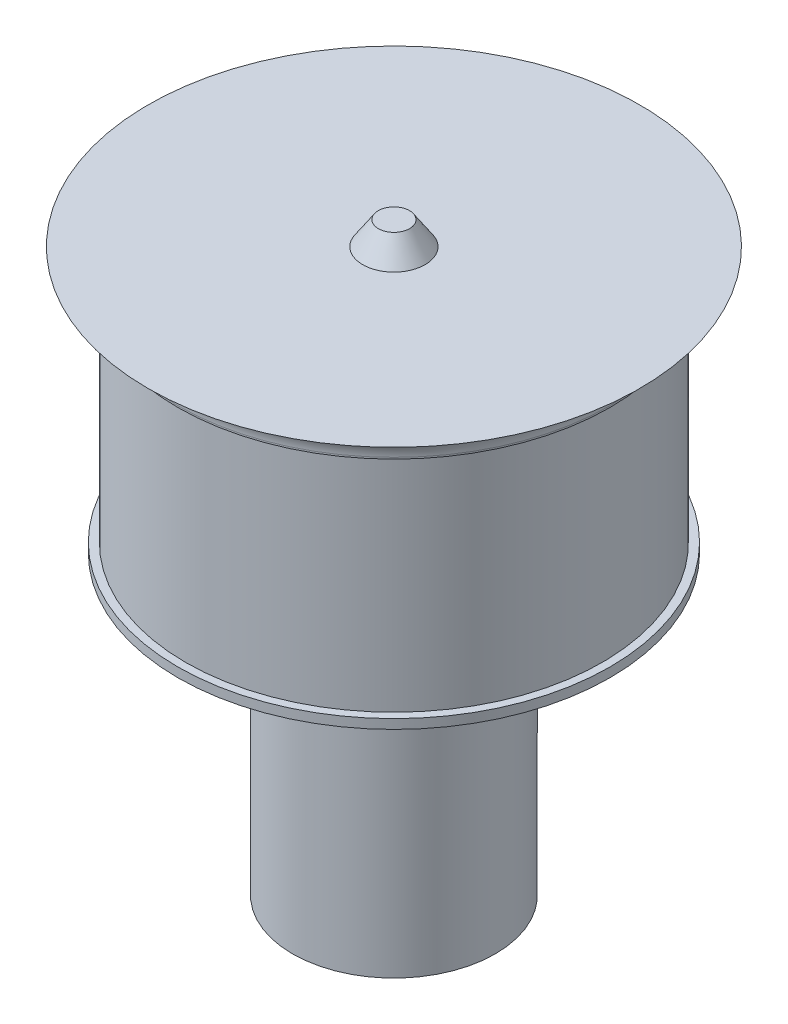
ISO-10303-21;
HEADER;
FILE_DESCRIPTION(('STEP AP214'),'2;1');
FILE_NAME('part.step','',(''),(''),'','','');
FILE_SCHEMA(('AUTOMOTIVE_DESIGN { 1 0 10303 214 1 1 1 1 }'));
ENDSEC;
DATA;
#1=APPLICATION_CONTEXT('core data for automotive mechanical design processes');
#2=APPLICATION_PROTOCOL_DEFINITION('international standard','automotive_design',2000,#1);
#3=PRODUCT_CONTEXT('',#1,'mechanical');
#4=PRODUCT('Part','Part','',(#3));
#5=PRODUCT_RELATED_PRODUCT_CATEGORY('part','',(#4));
#6=PRODUCT_DEFINITION_FORMATION('','',#4);
#7=PRODUCT_DEFINITION_CONTEXT('part definition',#1,'design');
#8=PRODUCT_DEFINITION('design','',#6,#7);
#9=PRODUCT_DEFINITION_SHAPE('','',#8);
#10=(LENGTH_UNIT() NAMED_UNIT(*) SI_UNIT(.MILLI.,.METRE.));
#11=(NAMED_UNIT(*) PLANE_ANGLE_UNIT() SI_UNIT($,.RADIAN.));
#12=(NAMED_UNIT(*) SI_UNIT($,.STERADIAN.) SOLID_ANGLE_UNIT());
#13=UNCERTAINTY_MEASURE_WITH_UNIT(LENGTH_MEASURE(1.E-05),#10,'distance_accuracy_value','');
#14=(GEOMETRIC_REPRESENTATION_CONTEXT(3) GLOBAL_UNCERTAINTY_ASSIGNED_CONTEXT((#13)) GLOBAL_UNIT_ASSIGNED_CONTEXT((#10,
#11,#12)) REPRESENTATION_CONTEXT('',''));
#15=CARTESIAN_POINT('',(0.,0.,0.));
#16=DIRECTION('',(0.,0.,1.));
#17=DIRECTION('',(1.,0.,0.));
#18=AXIS2_PLACEMENT_3D('',#15,#16,#17);
#19=CARTESIAN_POINT('',(0.,28.8,0.));
#20=DIRECTION('',(0.,-1.,0.));
#21=DIRECTION('',(0.,0.,-1.));
#22=AXIS2_PLACEMENT_3D('',#19,#20,#21);
#23=CYLINDRICAL_SURFACE('',#22,26.7);
#24=CARTESIAN_POINT('',(0.,28.8,0.));
#25=DIRECTION('',(0.,1.,0.));
#26=DIRECTION('',(0.,0.,1.));
#27=AXIS2_PLACEMENT_3D('',#24,#25,#26);
#28=CIRCLE('',#27,26.7);
#29=CARTESIAN_POINT('',(0.,28.8,26.7));
#30=VERTEX_POINT('',#29);
#31=EDGE_CURVE('E48',#30,#30,#28,.T.);
#32=ORIENTED_EDGE('',*,*,#31,.F.);
#33=EDGE_LOOP('',(#32));
#34=FACE_BOUND('',#33,.T.);
#35=CARTESIAN_POINT('',(0.,0.,0.));
#36=DIRECTION('',(0.,1.,0.));
#37=DIRECTION('',(0.,0.,1.));
#38=AXIS2_PLACEMENT_3D('',#35,#36,#37);
#39=CIRCLE('',#38,26.7);
#40=CARTESIAN_POINT('',(0.,0.,26.7));
#41=VERTEX_POINT('',#40);
#42=EDGE_CURVE('E63',#41,#41,#39,.T.);
#43=ORIENTED_EDGE('',*,*,#42,.T.);
#44=EDGE_LOOP('',(#43));
#45=FACE_BOUND('',#44,.T.);
#46=ADVANCED_FACE('F37',(#34,#45),#23,.T.);
#47=CARTESIAN_POINT('',(0.,37.254136020438,0.));
#48=DIRECTION('',(0.,1.,0.));
#49=DIRECTION('',(0.,0.,1.));
#50=AXIS2_PLACEMENT_3D('',#47,#48,#49);
#51=CYLINDRICAL_SURFACE('',#50,27.7);
#52=CARTESIAN_POINT('',(0.,28.8,0.));
#53=DIRECTION('',(0.,1.,0.));
#54=DIRECTION('',(0.,0.,1.));
#55=AXIS2_PLACEMENT_3D('',#52,#53,#54);
#56=CIRCLE('',#55,27.7);
#57=CARTESIAN_POINT('',(0.,28.8,27.7));
#58=VERTEX_POINT('',#57);
#59=EDGE_CURVE('E57',#58,#58,#56,.T.);
#60=ORIENTED_EDGE('',*,*,#59,.T.);
#61=EDGE_LOOP('',(#60));
#62=FACE_BOUND('',#61,.T.);
#63=CARTESIAN_POINT('',(0.,29.,0.));
#64=DIRECTION('',(0.,1.,0.));
#65=DIRECTION('',(0.,0.,1.));
#66=AXIS2_PLACEMENT_3D('',#63,#64,#65);
#67=CIRCLE('',#66,27.7);
#68=CARTESIAN_POINT('',(0.,29.,27.7));
#69=VERTEX_POINT('',#68);
#70=EDGE_CURVE('E52',#69,#69,#67,.T.);
#71=ORIENTED_EDGE('',*,*,#70,.F.);
#72=EDGE_LOOP('',(#71));
#73=FACE_BOUND('',#72,.T.);
#74=ADVANCED_FACE('F108',(#62,#73),#51,.T.);
#75=CARTESIAN_POINT('',(-1.9984014443253E-13,28.8,0.));
#76=DIRECTION('',(0.,1.,0.));
#77=DIRECTION('',(0.,0.,1.));
#78=AXIS2_PLACEMENT_3D('',#75,#76,#77);
#79=PLANE('',#78);
#80=ORIENTED_EDGE('',*,*,#31,.T.);
#81=EDGE_LOOP('',(#80));
#82=FACE_BOUND('',#81,.T.);
#83=ORIENTED_EDGE('',*,*,#59,.F.);
#84=EDGE_LOOP('',(#83));
#85=FACE_BOUND('',#84,.T.);
#86=ADVANCED_FACE('F113',(#82,#85),#79,.F.);
#87=CARTESIAN_POINT('',(0.,29.,0.));
#88=DIRECTION('',(0.,1.,0.));
#89=DIRECTION('',(0.,0.,1.));
#90=AXIS2_PLACEMENT_3D('',#87,#88,#89);
#91=TOROIDAL_SURFACE('',#90,31.5,3.80000000000002);
#92=CARTESIAN_POINT('',(0.,32.8,0.));
#93=DIRECTION('',(0.,1.,0.));
#94=DIRECTION('',(0.,0.,1.));
#95=AXIS2_PLACEMENT_3D('',#92,#93,#94);
#96=CIRCLE('',#95,31.5);
#97=CARTESIAN_POINT('',(0.,32.8,31.5));
#98=VERTEX_POINT('',#97);
#99=EDGE_CURVE('E60',#98,#98,#96,.T.);
#100=ORIENTED_EDGE('',*,*,#99,.F.);
#101=EDGE_LOOP('',(#100));
#102=FACE_BOUND('',#101,.T.);
#103=ORIENTED_EDGE('',*,*,#70,.T.);
#104=EDGE_LOOP('',(#103));
#105=FACE_BOUND('',#104,.T.);
#106=ADVANCED_FACE('F121',(#102,#105),#91,.F.);
#107=CARTESIAN_POINT('',(0.,32.8,0.));
#108=DIRECTION('',(0.,1.,0.));
#109=DIRECTION('',(0.,0.,1.));
#110=AXIS2_PLACEMENT_3D('',#107,#108,#109);
#111=PLANE('',#110);
#112=CARTESIAN_POINT('',(0.,32.8,0.));
#113=DIRECTION('',(0.,-1.,0.));
#114=DIRECTION('',(0.,0.,-1.));
#115=AXIS2_PLACEMENT_3D('',#112,#113,#114);
#116=CIRCLE('',#115,4.);
#117=CARTESIAN_POINT('',(0.,32.8,-4.));
#118=VERTEX_POINT('',#117);
#119=EDGE_CURVE('E84',#118,#118,#116,.T.);
#120=ORIENTED_EDGE('',*,*,#119,.T.);
#121=EDGE_LOOP('',(#120));
#122=FACE_BOUND('',#121,.T.);
#123=ORIENTED_EDGE('',*,*,#99,.T.);
#124=EDGE_LOOP('',(#123));
#125=FACE_BOUND('',#124,.T.);
#126=ADVANCED_FACE('F88',(#122,#125),#111,.T.);
#127=CARTESIAN_POINT('',(0.,9.53257950653832,0.));
#128=DIRECTION('',(0.,1.,0.));
#129=DIRECTION('',(0.,0.,1.));
#130=AXIS2_PLACEMENT_3D('',#127,#128,#129);
#131=CYLINDRICAL_SURFACE('',#130,27.7);
#132=CARTESIAN_POINT('',(0.,-1.2,0.));
#133=DIRECTION('',(0.,1.,0.));
#134=DIRECTION('',(0.,0.,1.));
#135=AXIS2_PLACEMENT_3D('',#132,#133,#134);
#136=CIRCLE('',#135,27.7);
#137=CARTESIAN_POINT('',(0.,-1.2,27.7));
#138=VERTEX_POINT('',#137);
#139=EDGE_CURVE('E69',#138,#138,#136,.T.);
#140=ORIENTED_EDGE('',*,*,#139,.T.);
#141=EDGE_LOOP('',(#140));
#142=FACE_BOUND('',#141,.T.);
#143=CARTESIAN_POINT('',(0.,0.,0.));
#144=DIRECTION('',(0.,1.,0.));
#145=DIRECTION('',(0.,0.,1.));
#146=AXIS2_PLACEMENT_3D('',#143,#144,#145);
#147=CIRCLE('',#146,27.7);
#148=CARTESIAN_POINT('',(0.,0.,27.7));
#149=VERTEX_POINT('',#148);
#150=EDGE_CURVE('E66',#149,#149,#147,.T.);
#151=ORIENTED_EDGE('',*,*,#150,.F.);
#152=EDGE_LOOP('',(#151));
#153=FACE_BOUND('',#152,.T.);
#154=ADVANCED_FACE('F128',(#142,#153),#131,.T.);
#155=CARTESIAN_POINT('',(-27.7,0.,0.));
#156=DIRECTION('',(0.,1.,0.));
#157=DIRECTION('',(0.,0.,1.));
#158=AXIS2_PLACEMENT_3D('',#155,#156,#157);
#159=PLANE('',#158);
#160=ORIENTED_EDGE('',*,*,#42,.F.);
#161=EDGE_LOOP('',(#160));
#162=FACE_BOUND('',#161,.T.);
#163=ORIENTED_EDGE('',*,*,#150,.T.);
#164=EDGE_LOOP('',(#163));
#165=FACE_BOUND('',#164,.T.);
#166=ADVANCED_FACE('F131',(#162,#165),#159,.T.);
#167=CARTESIAN_POINT('',(0.,-1.2,0.));
#168=DIRECTION('',(0.,1.,0.));
#169=DIRECTION('',(0.,0.,1.));
#170=AXIS2_PLACEMENT_3D('',#167,#168,#169);
#171=CONICAL_SURFACE('',#170,27.7,1.30511998281929);
#172=CARTESIAN_POINT('',(0.,-5.2,0.));
#173=DIRECTION('',(0.,1.,0.));
#174=DIRECTION('',(0.,0.,1.));
#175=AXIS2_PLACEMENT_3D('',#172,#173,#174);
#176=CIRCLE('',#175,13.);
#177=CARTESIAN_POINT('',(0.,-5.2,13.));
#178=VERTEX_POINT('',#177);
#179=EDGE_CURVE('E78',#178,#178,#176,.T.);
#180=ORIENTED_EDGE('',*,*,#179,.T.);
#181=EDGE_LOOP('',(#180));
#182=FACE_BOUND('',#181,.T.);
#183=ORIENTED_EDGE('',*,*,#139,.F.);
#184=EDGE_LOOP('',(#183));
#185=FACE_BOUND('',#184,.T.);
#186=ADVANCED_FACE('F134',(#182,#185),#171,.T.);
#187=CARTESIAN_POINT('',(0.,-7.2,0.));
#188=DIRECTION('',(0.,-1.,0.));
#189=DIRECTION('',(0.,0.,-1.));
#190=AXIS2_PLACEMENT_3D('',#187,#188,#189);
#191=CONICAL_SURFACE('',#190,13.,0.463647609000806);
#192=CARTESIAN_POINT('',(0.,-5.2,0.));
#193=DIRECTION('',(0.,1.,0.));
#194=DIRECTION('',(0.,0.,1.));
#195=AXIS2_PLACEMENT_3D('',#192,#193,#194);
#196=CIRCLE('',#195,12.);
#197=CARTESIAN_POINT('',(0.,-5.2,12.));
#198=VERTEX_POINT('',#197);
#199=EDGE_CURVE('E75',#198,#198,#196,.T.);
#200=ORIENTED_EDGE('',*,*,#199,.F.);
#201=EDGE_LOOP('',(#200));
#202=FACE_BOUND('',#201,.T.);
#203=CARTESIAN_POINT('',(0.,-7.2,0.));
#204=DIRECTION('',(0.,1.,0.));
#205=DIRECTION('',(0.,0.,1.));
#206=AXIS2_PLACEMENT_3D('',#203,#204,#205);
#207=CIRCLE('',#206,13.);
#208=CARTESIAN_POINT('',(0.,-7.2,13.));
#209=VERTEX_POINT('',#208);
#210=EDGE_CURVE('E72',#209,#209,#207,.T.);
#211=ORIENTED_EDGE('',*,*,#210,.T.);
#212=EDGE_LOOP('',(#211));
#213=FACE_BOUND('',#212,.T.);
#214=ADVANCED_FACE('F143',(#202,#213),#191,.T.);
#215=CARTESIAN_POINT('',(-13.,-5.2,0.));
#216=DIRECTION('',(0.,1.,0.));
#217=DIRECTION('',(0.,0.,1.));
#218=AXIS2_PLACEMENT_3D('',#215,#216,#217);
#219=PLANE('',#218);
#220=ORIENTED_EDGE('',*,*,#179,.F.);
#221=EDGE_LOOP('',(#220));
#222=FACE_BOUND('',#221,.T.);
#223=ORIENTED_EDGE('',*,*,#199,.T.);
#224=EDGE_LOOP('',(#223));
#225=FACE_BOUND('',#224,.T.);
#226=ADVANCED_FACE('F140',(#222,#225),#219,.F.);
#227=CARTESIAN_POINT('',(0.,-40.2,0.));
#228=DIRECTION('',(0.,-1.,0.));
#229=DIRECTION('',(0.,0.,-1.));
#230=AXIS2_PLACEMENT_3D('',#227,#228,#229);
#231=PLANE('',#230);
#232=CARTESIAN_POINT('',(0.,-40.2,0.));
#233=DIRECTION('',(0.,-1.,0.));
#234=DIRECTION('',(0.,0.,-1.));
#235=AXIS2_PLACEMENT_3D('',#232,#233,#234);
#236=CIRCLE('',#235,11.5);
#237=CARTESIAN_POINT('',(0.,-40.2,-11.5));
#238=VERTEX_POINT('',#237);
#239=EDGE_CURVE('E44',#238,#238,#236,.T.);
#240=ORIENTED_EDGE('',*,*,#239,.T.);
#241=EDGE_LOOP('',(#240));
#242=FACE_BOUND('',#241,.T.);
#243=ADVANCED_FACE('F137',(#242),#231,.T.);
#244=CARTESIAN_POINT('',(0.,-40.2,0.));
#245=DIRECTION('',(0.,1.,0.));
#246=DIRECTION('',(0.,0.,1.));
#247=AXIS2_PLACEMENT_3D('',#244,#245,#246);
#248=CONICAL_SURFACE('',#247,11.5,0.982793723247328);
#249=CARTESIAN_POINT('',(0.,-39.2,0.));
#250=DIRECTION('',(0.,-1.,0.));
#251=DIRECTION('',(0.,0.,-1.));
#252=AXIS2_PLACEMENT_3D('',#249,#250,#251);
#253=CIRCLE('',#252,13.);
#254=CARTESIAN_POINT('',(0.,-39.2,-13.));
#255=VERTEX_POINT('',#254);
#256=EDGE_CURVE('E10',#255,#255,#253,.F.);
#257=ORIENTED_EDGE('',*,*,#256,.F.);
#258=EDGE_LOOP('',(#257));
#259=FACE_BOUND('',#258,.T.);
#260=ORIENTED_EDGE('',*,*,#239,.F.);
#261=EDGE_LOOP('',(#260));
#262=FACE_BOUND('',#261,.T.);
#263=ADVANCED_FACE('F39',(#259,#262),#248,.T.);
#264=CARTESIAN_POINT('',(0.,-40.2,0.));
#265=DIRECTION('',(0.,1.,0.));
#266=DIRECTION('',(0.,0.,1.));
#267=AXIS2_PLACEMENT_3D('',#264,#265,#266);
#268=CYLINDRICAL_SURFACE('',#267,13.);
#269=ORIENTED_EDGE('',*,*,#210,.F.);
#270=EDGE_LOOP('',(#269));
#271=FACE_BOUND('',#270,.T.);
#272=ORIENTED_EDGE('',*,*,#256,.T.);
#273=EDGE_LOOP('',(#272));
#274=FACE_BOUND('',#273,.T.);
#275=ADVANCED_FACE('F99',(#271,#274),#268,.T.);
#276=CARTESIAN_POINT('',(0.,35.8,0.));
#277=DIRECTION('',(0.,-1.,0.));
#278=DIRECTION('',(0.,0.,-1.));
#279=AXIS2_PLACEMENT_3D('',#276,#277,#278);
#280=PLANE('',#279);
#281=CARTESIAN_POINT('',(0.,35.8,0.));
#282=DIRECTION('',(0.,-1.,0.));
#283=DIRECTION('',(0.,0.,-1.));
#284=AXIS2_PLACEMENT_3D('',#281,#282,#283);
#285=CIRCLE('',#284,2.);
#286=CARTESIAN_POINT('',(0.,35.8,-2.));
#287=VERTEX_POINT('',#286);
#288=EDGE_CURVE('E81',#287,#287,#285,.T.);
#289=ORIENTED_EDGE('',*,*,#288,.F.);
#290=EDGE_LOOP('',(#289));
#291=FACE_BOUND('',#290,.T.);
#292=ADVANCED_FACE('F94',(#291),#280,.F.);
#293=CARTESIAN_POINT('',(0.,35.8,0.));
#294=DIRECTION('',(0.,-1.,0.));
#295=DIRECTION('',(0.,0.,-1.));
#296=AXIS2_PLACEMENT_3D('',#293,#294,#295);
#297=CONICAL_SURFACE('',#296,2.,0.588002603547566);
#298=ORIENTED_EDGE('',*,*,#119,.F.);
#299=EDGE_LOOP('',(#298));
#300=FACE_BOUND('',#299,.T.);
#301=ORIENTED_EDGE('',*,*,#288,.T.);
#302=EDGE_LOOP('',(#301));
#303=FACE_BOUND('',#302,.T.);
#304=ADVANCED_FACE('F91',(#300,#303),#297,.T.);
#305=CLOSED_SHELL('',(#46,#74,#86,#106,#126,#154,#166,#186,#214,#226,#243,#263,#275,#292,#304));
#306=MANIFOLD_SOLID_BREP('B2',#305);
#307=ADVANCED_BREP_SHAPE_REPRESENTATION('',(#18,#306),#14);
#308=SHAPE_DEFINITION_REPRESENTATION(#9,#307);
ENDSEC;
END-ISO-10303-21;
